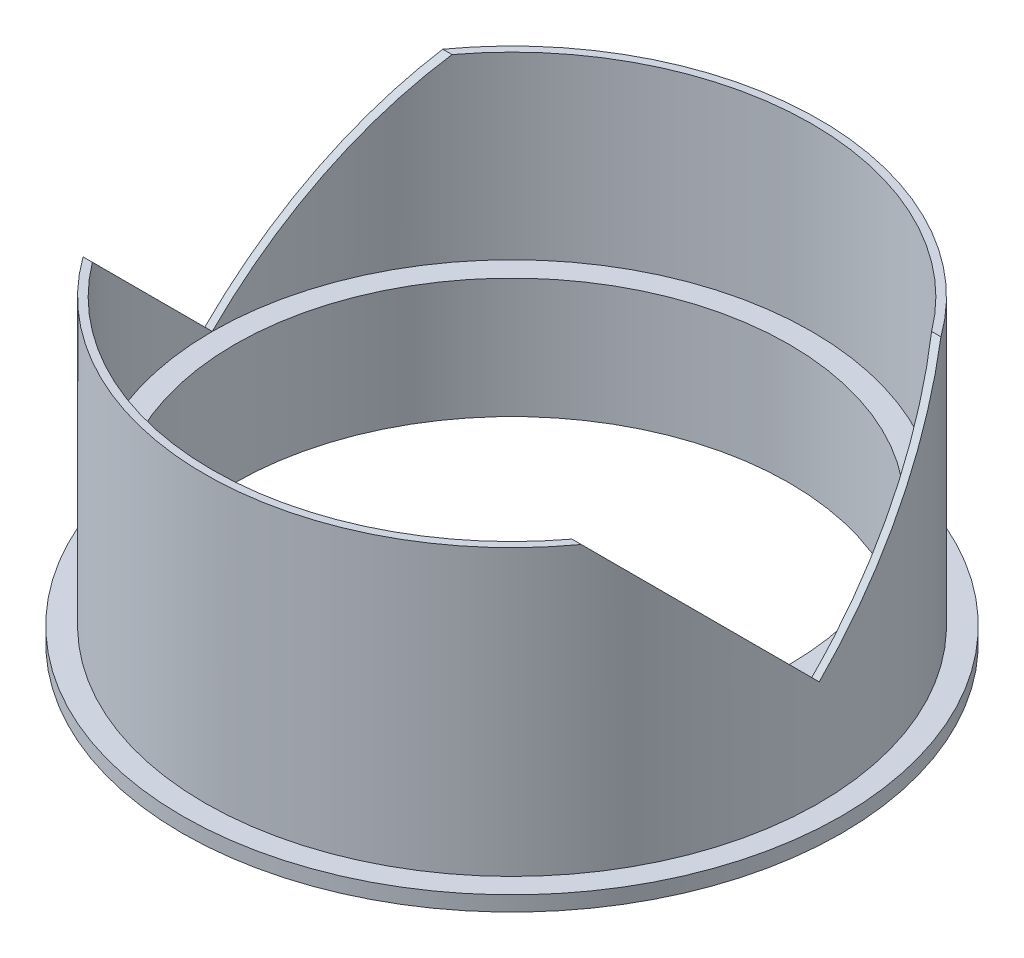
ISO-10303-21;
HEADER;
FILE_DESCRIPTION(('STEP AP214'),'2;1');
FILE_NAME('part.step','',(''),(''),'','','');
FILE_SCHEMA(('AUTOMOTIVE_DESIGN { 1 0 10303 214 1 1 1 1 }'));
ENDSEC;
DATA;
#1=APPLICATION_CONTEXT('core data for automotive mechanical design processes');
#2=APPLICATION_PROTOCOL_DEFINITION('international standard','automotive_design',2000,#1);
#3=PRODUCT_CONTEXT('',#1,'mechanical');
#4=PRODUCT('Part','Part','',(#3));
#5=PRODUCT_RELATED_PRODUCT_CATEGORY('part','',(#4));
#6=PRODUCT_DEFINITION_FORMATION('','',#4);
#7=PRODUCT_DEFINITION_CONTEXT('part definition',#1,'design');
#8=PRODUCT_DEFINITION('design','',#6,#7);
#9=PRODUCT_DEFINITION_SHAPE('','',#8);
#10=(LENGTH_UNIT() NAMED_UNIT(*) SI_UNIT(.MILLI.,.METRE.));
#11=(NAMED_UNIT(*) PLANE_ANGLE_UNIT() SI_UNIT($,.RADIAN.));
#12=(NAMED_UNIT(*) SI_UNIT($,.STERADIAN.) SOLID_ANGLE_UNIT());
#13=UNCERTAINTY_MEASURE_WITH_UNIT(LENGTH_MEASURE(1.E-05),#10,'distance_accuracy_value','');
#14=(GEOMETRIC_REPRESENTATION_CONTEXT(3) GLOBAL_UNCERTAINTY_ASSIGNED_CONTEXT((#13)) GLOBAL_UNIT_ASSIGNED_CONTEXT((#10,
#11,#12)) REPRESENTATION_CONTEXT('',''));
#15=CARTESIAN_POINT('',(0.,0.,0.));
#16=DIRECTION('',(0.,0.,1.));
#17=DIRECTION('',(1.,0.,0.));
#18=AXIS2_PLACEMENT_3D('',#15,#16,#17);
#19=CARTESIAN_POINT('',(0.,254.,0.));
#20=DIRECTION('',(0.,-1.,0.));
#21=DIRECTION('',(0.,0.,-1.));
#22=AXIS2_PLACEMENT_3D('',#19,#20,#21);
#23=CYLINDRICAL_SURFACE('',#22,127.);
#24=CARTESIAN_POINT('',(0.,50.8,0.));
#25=DIRECTION('',(0.,-0.707106781186544,0.707106781186551));
#26=DIRECTION('',(0.,-0.707106781186551,-0.707106781186544));
#27=AXIS2_PLACEMENT_3D('',#24,#25,#26);
#28=ELLIPSE('',#27,179.605122421384,127.);
#29=CARTESIAN_POINT('',(-101.600000000001,127.,76.1999999999992));
#30=VERTEX_POINT('',#29);
#31=CARTESIAN_POINT('',(-127.,50.8,0.));
#32=VERTEX_POINT('',#31);
#33=EDGE_CURVE('E132',#30,#32,#28,.T.);
#34=ORIENTED_EDGE('',*,*,#33,.F.);
#35=CARTESIAN_POINT('',(0.,127.,0.));
#36=DIRECTION('',(0.,-1.,0.));
#37=DIRECTION('',(0.,0.,-1.));
#38=AXIS2_PLACEMENT_3D('',#35,#36,#37);
#39=CIRCLE('',#38,127.);
#40=CARTESIAN_POINT('',(101.600000000001,127.,76.1999999999992));
#41=VERTEX_POINT('',#40);
#42=EDGE_CURVE('E127',#41,#30,#39,.T.);
#43=ORIENTED_EDGE('',*,*,#42,.F.);
#44=CARTESIAN_POINT('',(127.,50.8,0.));
#45=VERTEX_POINT('',#44);
#46=EDGE_CURVE('E130',#45,#41,#28,.T.);
#47=ORIENTED_EDGE('',*,*,#46,.F.);
#48=CARTESIAN_POINT('',(0.,50.8,0.));
#49=DIRECTION('',(0.,1.,0.));
#50=DIRECTION('',(0.,0.,1.));
#51=AXIS2_PLACEMENT_3D('',#48,#49,#50);
#52=CIRCLE('',#51,127.);
#53=EDGE_CURVE('E144',#45,#32,#52,.F.);
#54=ORIENTED_EDGE('',*,*,#53,.T.);
#55=EDGE_LOOP('',(#34,#43,#47,#54));
#56=FACE_BOUND('',#55,.T.);
#57=ADVANCED_FACE('F45',(#56),#23,.F.);
#58=CARTESIAN_POINT('',(0.,127.,130.175));
#59=DIRECTION('',(0.,-1.,0.));
#60=DIRECTION('',(0.,0.,-1.));
#61=AXIS2_PLACEMENT_3D('',#58,#59,#60);
#62=PLANE('',#61);
#63=CARTESIAN_POINT('',(0.,127.,0.));
#64=DIRECTION('',(0.,1.,0.));
#65=DIRECTION('',(0.,0.,1.));
#66=AXIS2_PLACEMENT_3D('',#63,#64,#65);
#67=CIRCLE('',#66,130.175);
#68=CARTESIAN_POINT('',(-105.541890380077,127.,76.1999999999992));
#69=VERTEX_POINT('',#68);
#70=CARTESIAN_POINT('',(105.541890380077,127.,76.1999999999992));
#71=VERTEX_POINT('',#70);
#72=EDGE_CURVE('E123',#69,#71,#67,.T.);
#73=ORIENTED_EDGE('',*,*,#72,.T.);
#74=DIRECTION('',(-1.,0.,0.));
#75=VECTOR('',#74,1.);
#76=CARTESIAN_POINT('',(0.,127.,76.1999999999992));
#77=LINE('',#76,#75);
#78=EDGE_CURVE('E11',#71,#41,#77,.T.);
#79=ORIENTED_EDGE('',*,*,#78,.T.);
#80=ORIENTED_EDGE('',*,*,#42,.T.);
#81=EDGE_CURVE('E49',#30,#69,#77,.T.);
#82=ORIENTED_EDGE('',*,*,#81,.T.);
#83=EDGE_LOOP('',(#73,#79,#80,#82));
#84=FACE_BOUND('',#83,.T.);
#85=ADVANCED_FACE('F168',(#84),#62,.F.);
#86=CARTESIAN_POINT('',(0.,50.8,0.));
#87=DIRECTION('',(0.,-1.,0.));
#88=DIRECTION('',(0.,0.,-1.));
#89=AXIS2_PLACEMENT_3D('',#86,#87,#88);
#90=CYLINDRICAL_SURFACE('',#89,117.475);
#91=CARTESIAN_POINT('',(0.,50.8,0.));
#92=DIRECTION('',(0.,1.,0.));
#93=DIRECTION('',(0.,0.,1.));
#94=AXIS2_PLACEMENT_3D('',#91,#92,#93);
#95=CIRCLE('',#94,117.475);
#96=CARTESIAN_POINT('',(0.,50.8,117.475));
#97=VERTEX_POINT('',#96);
#98=EDGE_CURVE('E153',#97,#97,#95,.T.);
#99=ORIENTED_EDGE('',*,*,#98,.T.);
#100=EDGE_LOOP('',(#99));
#101=FACE_BOUND('',#100,.T.);
#102=CARTESIAN_POINT('',(0.,0.,0.));
#103=DIRECTION('',(0.,1.,0.));
#104=DIRECTION('',(0.,0.,1.));
#105=AXIS2_PLACEMENT_3D('',#102,#103,#104);
#106=CIRCLE('',#105,117.475);
#107=CARTESIAN_POINT('',(0.,0.,117.475));
#108=VERTEX_POINT('',#107);
#109=EDGE_CURVE('E152',#108,#108,#106,.T.);
#110=ORIENTED_EDGE('',*,*,#109,.F.);
#111=EDGE_LOOP('',(#110));
#112=FACE_BOUND('',#111,.T.);
#113=ADVANCED_FACE('F47',(#101,#112),#90,.F.);
#114=CARTESIAN_POINT('',(0.,50.8,0.));
#115=DIRECTION('',(0.,1.,0.));
#116=DIRECTION('',(0.,0.,1.));
#117=AXIS2_PLACEMENT_3D('',#114,#115,#116);
#118=PLANE('',#117);
#119=ORIENTED_EDGE('',*,*,#98,.F.);
#120=EDGE_LOOP('',(#119));
#121=FACE_BOUND('',#120,.T.);
#122=ORIENTED_EDGE('',*,*,#53,.F.);
#123=EDGE_CURVE('E148',#32,#45,#52,.F.);
#124=ORIENTED_EDGE('',*,*,#123,.F.);
#125=EDGE_LOOP('',(#122,#124));
#126=FACE_BOUND('',#125,.T.);
#127=ADVANCED_FACE('F220',(#121,#126),#118,.T.);
#128=CARTESIAN_POINT('',(0.,0.,0.));
#129=DIRECTION('',(0.,1.,0.));
#130=DIRECTION('',(0.,0.,1.));
#131=AXIS2_PLACEMENT_3D('',#128,#129,#130);
#132=PLANE('',#131);
#133=ORIENTED_EDGE('',*,*,#109,.T.);
#134=EDGE_LOOP('',(#133));
#135=FACE_BOUND('',#134,.T.);
#136=CARTESIAN_POINT('',(0.,0.,0.));
#137=DIRECTION('',(0.,1.,0.));
#138=DIRECTION('',(0.,0.,1.));
#139=AXIS2_PLACEMENT_3D('',#136,#137,#138);
#140=CIRCLE('',#139,139.7);
#141=CARTESIAN_POINT('',(0.,0.,139.7));
#142=VERTEX_POINT('',#141);
#143=EDGE_CURVE('E140',#142,#142,#140,.T.);
#144=ORIENTED_EDGE('',*,*,#143,.F.);
#145=EDGE_LOOP('',(#144));
#146=FACE_BOUND('',#145,.T.);
#147=ADVANCED_FACE('F214',(#135,#146),#132,.F.);
#148=CARTESIAN_POINT('',(0.,50.8,0.));
#149=DIRECTION('',(0.,-0.707106781186544,-0.707106781186552));
#150=DIRECTION('',(0.,-0.707106781186551,0.707106781186544));
#151=AXIS2_PLACEMENT_3D('',#148,#149,#150);
#152=ELLIPSE('',#151,179.605122421384,127.);
#153=CARTESIAN_POINT('',(-101.600000000001,127.,-76.1999999999992));
#154=VERTEX_POINT('',#153);
#155=EDGE_CURVE('E69',#32,#154,#152,.T.);
#156=ORIENTED_EDGE('',*,*,#155,.F.);
#157=ORIENTED_EDGE('',*,*,#123,.T.);
#158=CARTESIAN_POINT('',(101.600000000001,127.,-76.1999999999992));
#159=VERTEX_POINT('',#158);
#160=EDGE_CURVE('E118',#159,#45,#152,.T.);
#161=ORIENTED_EDGE('',*,*,#160,.F.);
#162=EDGE_CURVE('E122',#154,#159,#39,.T.);
#163=ORIENTED_EDGE('',*,*,#162,.F.);
#164=EDGE_LOOP('',(#156,#157,#161,#163));
#165=FACE_BOUND('',#164,.T.);
#166=ADVANCED_FACE('F191',(#165),#23,.F.);
#167=CARTESIAN_POINT('',(0.,254.,0.));
#168=DIRECTION('',(0.,-1.,0.));
#169=DIRECTION('',(0.,0.,-1.));
#170=AXIS2_PLACEMENT_3D('',#167,#168,#169);
#171=CYLINDRICAL_SURFACE('',#170,130.175);
#172=ORIENTED_EDGE('',*,*,#72,.F.);
#173=CARTESIAN_POINT('',(0.,50.8,0.));
#174=DIRECTION('',(0.,-0.707106781186544,0.707106781186551));
#175=DIRECTION('',(0.,-0.707106781186551,-0.707106781186544));
#176=AXIS2_PLACEMENT_3D('',#173,#174,#175);
#177=ELLIPSE('',#176,184.095250481919,130.175);
#178=CARTESIAN_POINT('',(-130.175,50.8,0.));
#179=VERTEX_POINT('',#178);
#180=EDGE_CURVE('E116',#69,#179,#177,.T.);
#181=ORIENTED_EDGE('',*,*,#180,.T.);
#182=CARTESIAN_POINT('',(0.,50.8,0.));
#183=DIRECTION('',(0.,-0.707106781186544,-0.707106781186552));
#184=DIRECTION('',(0.,-0.707106781186551,0.707106781186544));
#185=AXIS2_PLACEMENT_3D('',#182,#183,#184);
#186=ELLIPSE('',#185,184.095250481919,130.175);
#187=CARTESIAN_POINT('',(-105.541890380077,127.,-76.1999999999992));
#188=VERTEX_POINT('',#187);
#189=EDGE_CURVE('E101',#179,#188,#186,.T.);
#190=ORIENTED_EDGE('',*,*,#189,.T.);
#191=CARTESIAN_POINT('',(105.541890380077,127.,-76.1999999999992));
#192=VERTEX_POINT('',#191);
#193=EDGE_CURVE('E115',#192,#188,#67,.T.);
#194=ORIENTED_EDGE('',*,*,#193,.F.);
#195=CARTESIAN_POINT('',(130.175,50.8,0.));
#196=VERTEX_POINT('',#195);
#197=EDGE_CURVE('E61',#192,#196,#186,.T.);
#198=ORIENTED_EDGE('',*,*,#197,.T.);
#199=EDGE_CURVE('E176',#196,#71,#177,.T.);
#200=ORIENTED_EDGE('',*,*,#199,.T.);
#201=EDGE_LOOP('',(#172,#181,#190,#194,#198,#200));
#202=FACE_BOUND('',#201,.T.);
#203=CARTESIAN_POINT('',(0.,6.35,0.));
#204=DIRECTION('',(0.,1.,0.));
#205=DIRECTION('',(0.,0.,1.));
#206=AXIS2_PLACEMENT_3D('',#203,#204,#205);
#207=CIRCLE('',#206,130.175);
#208=CARTESIAN_POINT('',(0.,6.35,130.175));
#209=VERTEX_POINT('',#208);
#210=EDGE_CURVE('E135',#209,#209,#207,.T.);
#211=ORIENTED_EDGE('',*,*,#210,.T.);
#212=EDGE_LOOP('',(#211));
#213=FACE_BOUND('',#212,.T.);
#214=ADVANCED_FACE('F113',(#202,#213),#171,.T.);
#215=CARTESIAN_POINT('',(0.,6.35,0.));
#216=DIRECTION('',(0.,-1.,0.));
#217=DIRECTION('',(0.,0.,-1.));
#218=AXIS2_PLACEMENT_3D('',#215,#216,#217);
#219=CYLINDRICAL_SURFACE('',#218,139.7);
#220=CARTESIAN_POINT('',(0.,6.35,0.));
#221=DIRECTION('',(0.,1.,0.));
#222=DIRECTION('',(0.,0.,1.));
#223=AXIS2_PLACEMENT_3D('',#220,#221,#222);
#224=CIRCLE('',#223,139.7);
#225=CARTESIAN_POINT('',(0.,6.35,139.7));
#226=VERTEX_POINT('',#225);
#227=EDGE_CURVE('E139',#226,#226,#224,.T.);
#228=ORIENTED_EDGE('',*,*,#227,.F.);
#229=EDGE_LOOP('',(#228));
#230=FACE_BOUND('',#229,.T.);
#231=ORIENTED_EDGE('',*,*,#143,.T.);
#232=EDGE_LOOP('',(#231));
#233=FACE_BOUND('',#232,.T.);
#234=ADVANCED_FACE('F219',(#230,#233),#219,.T.);
#235=CARTESIAN_POINT('',(0.,6.35,0.));
#236=DIRECTION('',(0.,1.,0.));
#237=DIRECTION('',(0.,0.,1.));
#238=AXIS2_PLACEMENT_3D('',#235,#236,#237);
#239=PLANE('',#238);
#240=ORIENTED_EDGE('',*,*,#210,.F.);
#241=EDGE_LOOP('',(#240));
#242=FACE_BOUND('',#241,.T.);
#243=ORIENTED_EDGE('',*,*,#227,.T.);
#244=EDGE_LOOP('',(#243));
#245=FACE_BOUND('',#244,.T.);
#246=ADVANCED_FACE('F231',(#242,#245),#239,.T.);
#247=ORIENTED_EDGE('',*,*,#193,.T.);
#248=DIRECTION('',(1.,0.,0.));
#249=VECTOR('',#248,1.);
#250=CARTESIAN_POINT('',(0.,127.,-76.1999999999992));
#251=LINE('',#250,#249);
#252=EDGE_CURVE('E98',#188,#154,#251,.T.);
#253=ORIENTED_EDGE('',*,*,#252,.T.);
#254=ORIENTED_EDGE('',*,*,#162,.T.);
#255=EDGE_CURVE('E108',#159,#192,#251,.T.);
#256=ORIENTED_EDGE('',*,*,#255,.T.);
#257=EDGE_LOOP('',(#247,#253,#254,#256));
#258=FACE_BOUND('',#257,.T.);
#259=ADVANCED_FACE('F120',(#258),#62,.F.);
#260=CARTESIAN_POINT('',(-139.7,127.,-76.1999999999992));
#261=DIRECTION('',(0.,-0.707106781186544,-0.707106781186552));
#262=DIRECTION('',(0.,0.707106781186551,-0.707106781186544));
#263=AXIS2_PLACEMENT_3D('',#260,#261,#262);
#264=PLANE('',#263);
#265=ORIENTED_EDGE('',*,*,#160,.T.);
#266=DIRECTION('',(1.,0.,0.));
#267=VECTOR('',#266,1.);
#268=CARTESIAN_POINT('',(-139.7,50.8,0.));
#269=LINE('',#268,#267);
#270=EDGE_CURVE('E186',#45,#196,#269,.T.);
#271=ORIENTED_EDGE('',*,*,#270,.T.);
#272=ORIENTED_EDGE('',*,*,#197,.F.);
#273=ORIENTED_EDGE('',*,*,#255,.F.);
#274=EDGE_LOOP('',(#265,#271,#272,#273));
#275=FACE_BOUND('',#274,.T.);
#276=ADVANCED_FACE('F194',(#275),#264,.F.);
#277=CARTESIAN_POINT('',(-139.7,50.8,0.));
#278=DIRECTION('',(0.,-0.707106781186544,0.707106781186551));
#279=DIRECTION('',(0.,-0.707106781186551,-0.707106781186544));
#280=AXIS2_PLACEMENT_3D('',#277,#278,#279);
#281=PLANE('',#280);
#282=ORIENTED_EDGE('',*,*,#46,.T.);
#283=ORIENTED_EDGE('',*,*,#78,.F.);
#284=ORIENTED_EDGE('',*,*,#199,.F.);
#285=ORIENTED_EDGE('',*,*,#270,.F.);
#286=EDGE_LOOP('',(#282,#283,#284,#285));
#287=FACE_BOUND('',#286,.T.);
#288=ADVANCED_FACE('F196',(#287),#281,.F.);
#289=ORIENTED_EDGE('',*,*,#33,.T.);
#290=EDGE_CURVE('E185',#179,#32,#269,.T.);
#291=ORIENTED_EDGE('',*,*,#290,.F.);
#292=ORIENTED_EDGE('',*,*,#180,.F.);
#293=ORIENTED_EDGE('',*,*,#81,.F.);
#294=EDGE_LOOP('',(#289,#291,#292,#293));
#295=FACE_BOUND('',#294,.T.);
#296=ADVANCED_FACE('F198',(#295),#281,.F.);
#297=ORIENTED_EDGE('',*,*,#155,.T.);
#298=ORIENTED_EDGE('',*,*,#252,.F.);
#299=ORIENTED_EDGE('',*,*,#189,.F.);
#300=ORIENTED_EDGE('',*,*,#290,.T.);
#301=EDGE_LOOP('',(#297,#298,#299,#300));
#302=FACE_BOUND('',#301,.T.);
#303=ADVANCED_FACE('F100',(#302),#264,.F.);
#304=CLOSED_SHELL('',(#57,#85,#113,#127,#147,#166,#214,#234,#246,#259,#276,#288,#296,#303));
#305=MANIFOLD_SOLID_BREP('B2',#304);
#306=ADVANCED_BREP_SHAPE_REPRESENTATION('',(#18,#305),#14);
#307=SHAPE_DEFINITION_REPRESENTATION(#9,#306);
ENDSEC;
END-ISO-10303-21;
